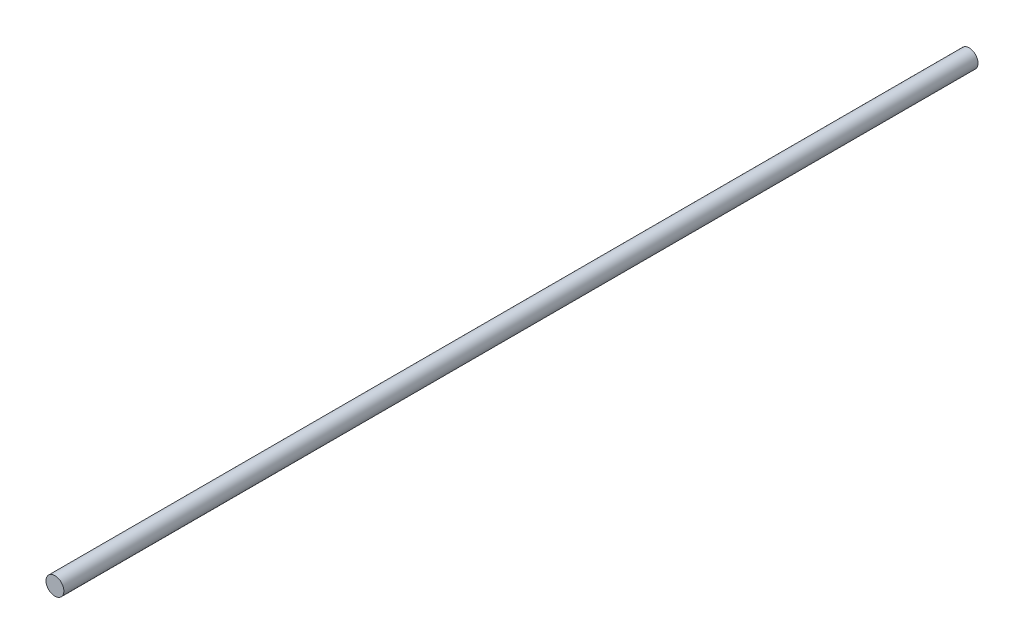
ISO-10303-21;
HEADER;
FILE_DESCRIPTION(('STEP AP214'),'2;1');
FILE_NAME('part.step','',(''),(''),'','','');
FILE_SCHEMA(('AUTOMOTIVE_DESIGN { 1 0 10303 214 1 1 1 1 }'));
ENDSEC;
DATA;
#1=APPLICATION_CONTEXT('core data for automotive mechanical design processes');
#2=APPLICATION_PROTOCOL_DEFINITION('international standard','automotive_design',2000,#1);
#3=PRODUCT_CONTEXT('',#1,'mechanical');
#4=PRODUCT('Part','Part','',(#3));
#5=PRODUCT_RELATED_PRODUCT_CATEGORY('part','',(#4));
#6=PRODUCT_DEFINITION_FORMATION('','',#4);
#7=PRODUCT_DEFINITION_CONTEXT('part definition',#1,'design');
#8=PRODUCT_DEFINITION('design','',#6,#7);
#9=PRODUCT_DEFINITION_SHAPE('','',#8);
#10=(LENGTH_UNIT() NAMED_UNIT(*) SI_UNIT(.MILLI.,.METRE.));
#11=(NAMED_UNIT(*) PLANE_ANGLE_UNIT() SI_UNIT($,.RADIAN.));
#12=(NAMED_UNIT(*) SI_UNIT($,.STERADIAN.) SOLID_ANGLE_UNIT());
#13=UNCERTAINTY_MEASURE_WITH_UNIT(LENGTH_MEASURE(1.E-05),#10,'distance_accuracy_value','');
#14=(GEOMETRIC_REPRESENTATION_CONTEXT(3) GLOBAL_UNCERTAINTY_ASSIGNED_CONTEXT((#13)) GLOBAL_UNIT_ASSIGNED_CONTEXT((#10,
#11,#12)) REPRESENTATION_CONTEXT('',''));
#15=CARTESIAN_POINT('',(0.,0.,0.));
#16=DIRECTION('',(0.,0.,1.));
#17=DIRECTION('',(1.,0.,0.));
#18=AXIS2_PLACEMENT_3D('',#15,#16,#17);
#19=CARTESIAN_POINT('',(0.,0.,410.));
#20=DIRECTION('',(0.,0.,-1.));
#21=DIRECTION('',(-1.,0.,0.));
#22=AXIS2_PLACEMENT_3D('',#19,#20,#21);
#23=CYLINDRICAL_SURFACE('',#22,4.);
#24=CARTESIAN_POINT('',(0.,0.,410.));
#25=DIRECTION('',(0.,0.,1.));
#26=DIRECTION('',(1.,0.,0.));
#27=AXIS2_PLACEMENT_3D('',#24,#25,#26);
#28=CIRCLE('',#27,4.);
#29=CARTESIAN_POINT('',(-4.,0.,410.));
#30=VERTEX_POINT('',#29);
#31=EDGE_CURVE('E10',#30,#30,#28,.T.);
#32=CARTESIAN_POINT('',(0.,0.,0.));
#33=DIRECTION('',(0.,0.,1.));
#34=DIRECTION('',(1.,0.,0.));
#35=AXIS2_PLACEMENT_3D('',#32,#33,#34);
#36=CIRCLE('',#35,4.);
#37=CARTESIAN_POINT('',(-4.,0.,0.));
#38=VERTEX_POINT('',#37);
#39=EDGE_CURVE('E44',#38,#38,#36,.T.);
#40=CARTESIAN_POINT('',(-4.,0.,410.));
#41=CARTESIAN_POINT('',(-4.,0.,405.729166666667));
#42=CARTESIAN_POINT('',(-4.,0.,401.458333333333));
#43=CARTESIAN_POINT('',(-4.,0.,392.916666666667));
#44=CARTESIAN_POINT('',(-4.,0.,388.645833333333));
#45=CARTESIAN_POINT('',(-4.,0.,380.104166666667));
#46=CARTESIAN_POINT('',(-4.,0.,375.833333333333));
#47=CARTESIAN_POINT('',(-4.,0.,367.291666666667));
#48=CARTESIAN_POINT('',(-4.,0.,363.020833333333));
#49=CARTESIAN_POINT('',(-4.,0.,354.479166666667));
#50=CARTESIAN_POINT('',(-4.,0.,350.208333333333));
#51=CARTESIAN_POINT('',(-4.,0.,341.666666666667));
#52=CARTESIAN_POINT('',(-4.,0.,337.395833333333));
#53=CARTESIAN_POINT('',(-4.,0.,328.854166666667));
#54=CARTESIAN_POINT('',(-4.,0.,324.583333333333));
#55=CARTESIAN_POINT('',(-4.,0.,316.041666666667));
#56=CARTESIAN_POINT('',(-4.,0.,311.770833333333));
#57=CARTESIAN_POINT('',(-4.,0.,303.229166666667));
#58=CARTESIAN_POINT('',(-4.,0.,298.958333333333));
#59=CARTESIAN_POINT('',(-4.,0.,290.416666666667));
#60=CARTESIAN_POINT('',(-4.,0.,286.145833333333));
#61=CARTESIAN_POINT('',(-4.,0.,277.604166666667));
#62=CARTESIAN_POINT('',(-4.,0.,273.333333333333));
#63=CARTESIAN_POINT('',(-4.,0.,264.791666666667));
#64=CARTESIAN_POINT('',(-4.,0.,260.520833333333));
#65=CARTESIAN_POINT('',(-4.,0.,251.979166666667));
#66=CARTESIAN_POINT('',(-4.,0.,247.708333333333));
#67=CARTESIAN_POINT('',(-4.,0.,239.166666666667));
#68=CARTESIAN_POINT('',(-4.,0.,234.895833333333));
#69=CARTESIAN_POINT('',(-4.,0.,226.354166666667));
#70=CARTESIAN_POINT('',(-4.,0.,222.083333333333));
#71=CARTESIAN_POINT('',(-4.,0.,213.541666666667));
#72=CARTESIAN_POINT('',(-4.,0.,209.270833333333));
#73=CARTESIAN_POINT('',(-4.,0.,200.729166666667));
#74=CARTESIAN_POINT('',(-4.,0.,196.458333333333));
#75=CARTESIAN_POINT('',(-4.,0.,187.916666666667));
#76=CARTESIAN_POINT('',(-4.,0.,183.645833333333));
#77=CARTESIAN_POINT('',(-4.,0.,175.104166666667));
#78=CARTESIAN_POINT('',(-4.,0.,170.833333333333));
#79=CARTESIAN_POINT('',(-4.,0.,162.291666666667));
#80=CARTESIAN_POINT('',(-4.,0.,158.020833333333));
#81=CARTESIAN_POINT('',(-4.,0.,149.479166666667));
#82=CARTESIAN_POINT('',(-4.,0.,145.208333333333));
#83=CARTESIAN_POINT('',(-4.,0.,136.666666666667));
#84=CARTESIAN_POINT('',(-4.,0.,132.395833333333));
#85=CARTESIAN_POINT('',(-4.,0.,123.854166666667));
#86=CARTESIAN_POINT('',(-4.,0.,119.583333333333));
#87=CARTESIAN_POINT('',(-4.,0.,111.041666666667));
#88=CARTESIAN_POINT('',(-4.,0.,106.770833333333));
#89=CARTESIAN_POINT('',(-4.,0.,98.2291666666667));
#90=CARTESIAN_POINT('',(-4.,0.,93.9583333333334));
#91=CARTESIAN_POINT('',(-4.,0.,85.4166666666667));
#92=CARTESIAN_POINT('',(-4.,0.,81.1458333333334));
#93=CARTESIAN_POINT('',(-4.,0.,72.6041666666667));
#94=CARTESIAN_POINT('',(-4.,0.,68.3333333333334));
#95=CARTESIAN_POINT('',(-4.,0.,59.7916666666667));
#96=CARTESIAN_POINT('',(-4.,0.,55.5208333333333));
#97=CARTESIAN_POINT('',(-4.,0.,46.9791666666667));
#98=CARTESIAN_POINT('',(-4.,0.,42.7083333333333));
#99=CARTESIAN_POINT('',(-4.,0.,34.1666666666667));
#100=CARTESIAN_POINT('',(-4.,0.,29.8958333333333));
#101=CARTESIAN_POINT('',(-4.,0.,21.3541666666667));
#102=CARTESIAN_POINT('',(-4.,0.,17.0833333333333));
#103=CARTESIAN_POINT('',(-4.,0.,8.54166666666667));
#104=CARTESIAN_POINT('',(-4.,0.,4.27083333333333));
#105=CARTESIAN_POINT('',(-4.,0.,0.));
#106=B_SPLINE_CURVE_WITH_KNOTS('',3,(#40,#41,#42,#43,#44,#45,#46,#47,#48,#49,#50,#51,#52,#53,
#54,#55,#56,#57,#58,#59,#60,#61,#62,#63,#64,#65,#66,#67,#68,#69,#70,#71,#72,#73,#74,#75,#76,#77,
#78,#79,#80,#81,#82,#83,#84,#85,#86,#87,#88,#89,#90,#91,#92,#93,#94,#95,#96,#97,#98,#99,#100,
#101,#102,#103,#104,#105),.UNSPECIFIED.,.F.,.F.,(4,2,2,2,2,2,2,2,2,2,2,2,2,2,2,2,2,2,2,2,2,2,2,
2,2,2,2,2,2,2,2,2,4),(0.,12.8125,25.625,38.4375,51.25,64.0625,76.875,89.6875,102.5,115.3125,
128.125,140.9375,153.75,166.5625,179.375,192.1875,205.,217.8125,230.625,243.4375,256.25,
269.0625,281.875,294.6875,307.5,320.3125,333.125,345.9375,358.75,371.5625,384.375,397.1875,
410.),.UNSPECIFIED.);
#107=EDGE_CURVE('BSEAM41',#30,#38,#106,.T.);
#108=ORIENTED_EDGE('',*,*,#31,.F.);
#109=ORIENTED_EDGE('',*,*,#39,.T.);
#110=ORIENTED_EDGE('',*,*,#107,.T.);
#111=ORIENTED_EDGE('',*,*,#107,.F.);
#112=EDGE_LOOP('',(#108,#110,#109,#111));
#113=FACE_BOUND('',#112,.T.);
#114=ADVANCED_FACE('F41',(#113),#23,.T.);
#115=CARTESIAN_POINT('',(0.,0.,410.));
#116=DIRECTION('',(0.,0.,1.));
#117=DIRECTION('',(1.,0.,0.));
#118=AXIS2_PLACEMENT_3D('',#115,#116,#117);
#119=PLANE('',#118);
#120=ORIENTED_EDGE('',*,*,#31,.T.);
#121=EDGE_LOOP('',(#120));
#122=FACE_BOUND('',#121,.T.);
#123=ADVANCED_FACE('F58',(#122),#119,.T.);
#124=CARTESIAN_POINT('',(0.,0.,0.));
#125=DIRECTION('',(0.,0.,1.));
#126=DIRECTION('',(1.,0.,0.));
#127=AXIS2_PLACEMENT_3D('',#124,#125,#126);
#128=PLANE('',#127);
#129=ORIENTED_EDGE('',*,*,#39,.F.);
#130=EDGE_LOOP('',(#129));
#131=FACE_BOUND('',#130,.T.);
#132=ADVANCED_FACE('F56',(#131),#128,.F.);
#133=CLOSED_SHELL('',(#114,#123,#132));
#134=MANIFOLD_SOLID_BREP('B2',#133);
#135=ADVANCED_BREP_SHAPE_REPRESENTATION('',(#18,#134),#14);
#136=SHAPE_DEFINITION_REPRESENTATION(#9,#135);
ENDSEC;
END-ISO-10303-21;
